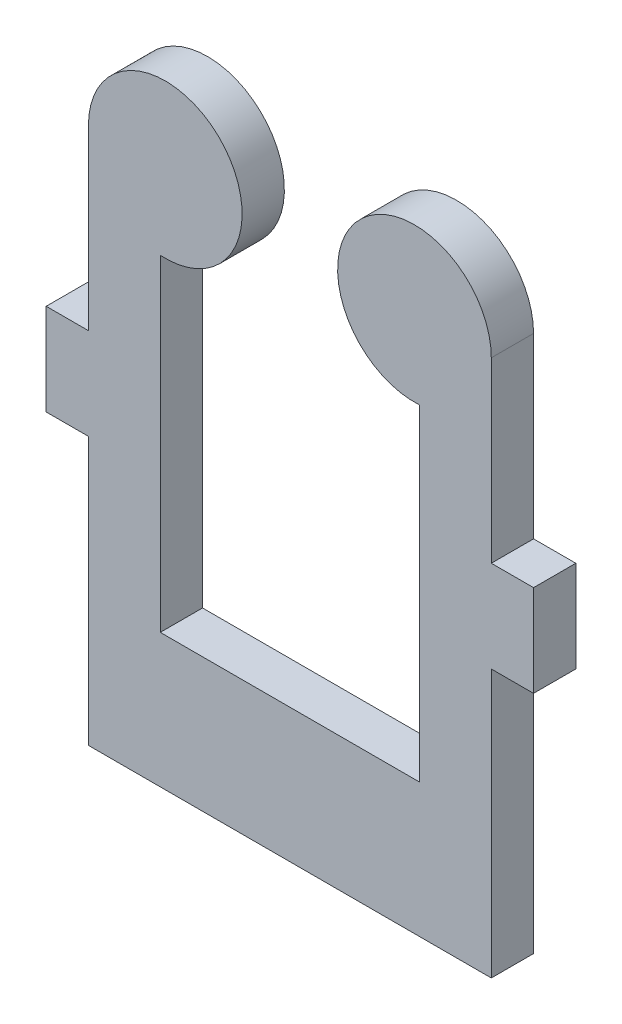
ISO-10303-21;
HEADER;
FILE_DESCRIPTION(('STEP AP214'),'2;1');
FILE_NAME('part.step','',(''),(''),'','','');
FILE_SCHEMA(('AUTOMOTIVE_DESIGN { 1 0 10303 214 1 1 1 1 }'));
ENDSEC;
DATA;
#1=APPLICATION_CONTEXT('core data for automotive mechanical design processes');
#2=APPLICATION_PROTOCOL_DEFINITION('international standard','automotive_design',2000,#1);
#3=PRODUCT_CONTEXT('',#1,'mechanical');
#4=PRODUCT('Part','Part','',(#3));
#5=PRODUCT_RELATED_PRODUCT_CATEGORY('part','',(#4));
#6=PRODUCT_DEFINITION_FORMATION('','',#4);
#7=PRODUCT_DEFINITION_CONTEXT('part definition',#1,'design');
#8=PRODUCT_DEFINITION('design','',#6,#7);
#9=PRODUCT_DEFINITION_SHAPE('','',#8);
#10=(LENGTH_UNIT() NAMED_UNIT(*) SI_UNIT(.MILLI.,.METRE.));
#11=(NAMED_UNIT(*) PLANE_ANGLE_UNIT() SI_UNIT($,.RADIAN.));
#12=(NAMED_UNIT(*) SI_UNIT($,.STERADIAN.) SOLID_ANGLE_UNIT());
#13=UNCERTAINTY_MEASURE_WITH_UNIT(LENGTH_MEASURE(1.E-05),#10,'distance_accuracy_value','');
#14=(GEOMETRIC_REPRESENTATION_CONTEXT(3) GLOBAL_UNCERTAINTY_ASSIGNED_CONTEXT((#13)) GLOBAL_UNIT_ASSIGNED_CONTEXT((#10,
#11,#12)) REPRESENTATION_CONTEXT('',''));
#15=CARTESIAN_POINT('',(0.,0.,0.));
#16=DIRECTION('',(0.,0.,1.));
#17=DIRECTION('',(1.,0.,0.));
#18=AXIS2_PLACEMENT_3D('',#15,#16,#17);
#19=CARTESIAN_POINT('',(-9.2,4.5,15.55));
#20=DIRECTION('',(-1.,0.,0.));
#21=DIRECTION('',(0.,-1.,0.));
#22=AXIS2_PLACEMENT_3D('',#19,#20,#21);
#23=PLANE('',#22);
#24=DIRECTION('',(0.,1.,0.));
#25=VECTOR('',#24,1.);
#26=CARTESIAN_POINT('',(-9.2,4.5,12.55));
#27=LINE('',#26,#25);
#28=CARTESIAN_POINT('',(-9.2,4.5,12.55));
#29=VERTEX_POINT('',#28);
#30=CARTESIAN_POINT('',(-9.20000000000001,27.686563585381,12.55));
#31=VERTEX_POINT('',#30);
#32=EDGE_CURVE('E188',#29,#31,#27,.T.);
#33=ORIENTED_EDGE('',*,*,#32,.T.);
#34=DIRECTION('',(0.,0.,-1.));
#35=VECTOR('',#34,1.);
#36=CARTESIAN_POINT('',(-9.20000000000001,27.686563585381,15.55));
#37=LINE('',#36,#35);
#38=CARTESIAN_POINT('',(-9.20000000000001,27.686563585381,15.55));
#39=VERTEX_POINT('',#38);
#40=EDGE_CURVE('E11',#39,#31,#37,.T.);
#41=ORIENTED_EDGE('',*,*,#40,.F.);
#42=DIRECTION('',(0.,1.,0.));
#43=VECTOR('',#42,1.);
#44=CARTESIAN_POINT('',(-9.2,4.5,15.55));
#45=LINE('',#44,#43);
#46=CARTESIAN_POINT('',(-9.2,4.5,15.55));
#47=VERTEX_POINT('',#46);
#48=EDGE_CURVE('E234',#47,#39,#45,.T.);
#49=ORIENTED_EDGE('',*,*,#48,.F.);
#50=DIRECTION('',(0.,0.,-1.));
#51=VECTOR('',#50,1.);
#52=CARTESIAN_POINT('',(-9.2,4.5,15.55));
#53=LINE('',#52,#51);
#54=EDGE_CURVE('E184',#47,#29,#53,.T.);
#55=ORIENTED_EDGE('',*,*,#54,.T.);
#56=EDGE_LOOP('',(#33,#41,#49,#55));
#57=FACE_BOUND('',#56,.T.);
#58=ADVANCED_FACE('F39',(#57),#23,.F.);
#59=CARTESIAN_POINT('',(-8.845,33.13,15.55));
#60=DIRECTION('',(0.,0.,-1.));
#61=DIRECTION('',(-1.,0.,0.));
#62=AXIS2_PLACEMENT_3D('',#59,#60,#61);
#63=CYLINDRICAL_SURFACE('',#62,5.455);
#64=CARTESIAN_POINT('',(-8.845,33.13,12.55));
#65=DIRECTION('',(0.,0.,1.));
#66=DIRECTION('',(1.,0.,0.));
#67=AXIS2_PLACEMENT_3D('',#64,#65,#66);
#68=CIRCLE('',#67,5.455);
#69=CARTESIAN_POINT('',(-14.3,33.13,12.55));
#70=VERTEX_POINT('',#69);
#71=EDGE_CURVE('E192',#31,#70,#68,.T.);
#72=ORIENTED_EDGE('',*,*,#71,.T.);
#73=DIRECTION('',(0.,0.,-1.));
#74=VECTOR('',#73,1.);
#75=CARTESIAN_POINT('',(-14.3,33.13,15.55));
#76=LINE('',#75,#74);
#77=CARTESIAN_POINT('',(-14.3,33.13,15.55));
#78=VERTEX_POINT('',#77);
#79=EDGE_CURVE('E48',#78,#70,#76,.T.);
#80=ORIENTED_EDGE('',*,*,#79,.F.);
#81=CARTESIAN_POINT('',(-8.845,33.13,15.55));
#82=DIRECTION('',(0.,0.,1.));
#83=DIRECTION('',(1.,0.,0.));
#84=AXIS2_PLACEMENT_3D('',#81,#82,#83);
#85=CIRCLE('',#84,5.455);
#86=EDGE_CURVE('E123',#39,#78,#85,.T.);
#87=ORIENTED_EDGE('',*,*,#86,.F.);
#88=ORIENTED_EDGE('',*,*,#40,.T.);
#89=EDGE_LOOP('',(#72,#80,#87,#88));
#90=FACE_BOUND('',#89,.T.);
#91=ADVANCED_FACE('F356',(#90),#63,.T.);
#92=CARTESIAN_POINT('',(-14.3,33.13,15.55));
#93=DIRECTION('',(1.,0.,0.));
#94=DIRECTION('',(0.,1.,0.));
#95=AXIS2_PLACEMENT_3D('',#92,#93,#94);
#96=PLANE('',#95);
#97=DIRECTION('',(0.,-1.,0.));
#98=VECTOR('',#97,1.);
#99=CARTESIAN_POINT('',(-14.3,33.13,12.55));
#100=LINE('',#99,#98);
#101=CARTESIAN_POINT('',(-14.3,20.5,12.55));
#102=VERTEX_POINT('',#101);
#103=EDGE_CURVE('E195',#70,#102,#100,.T.);
#104=ORIENTED_EDGE('',*,*,#103,.T.);
#105=DIRECTION('',(0.,0.,-1.));
#106=VECTOR('',#105,1.);
#107=CARTESIAN_POINT('',(-14.3,20.5,15.55));
#108=LINE('',#107,#106);
#109=CARTESIAN_POINT('',(-14.3,20.5,15.55));
#110=VERTEX_POINT('',#109);
#111=EDGE_CURVE('E277',#110,#102,#108,.T.);
#112=ORIENTED_EDGE('',*,*,#111,.F.);
#113=DIRECTION('',(0.,-1.,0.));
#114=VECTOR('',#113,1.);
#115=CARTESIAN_POINT('',(-14.3,33.13,15.55));
#116=LINE('',#115,#114);
#117=EDGE_CURVE('E287',#78,#110,#116,.T.);
#118=ORIENTED_EDGE('',*,*,#117,.F.);
#119=ORIENTED_EDGE('',*,*,#79,.T.);
#120=EDGE_LOOP('',(#104,#112,#118,#119));
#121=FACE_BOUND('',#120,.T.);
#122=ADVANCED_FACE('F285',(#121),#96,.F.);
#123=CARTESIAN_POINT('',(-14.3,20.5,15.55));
#124=DIRECTION('',(0.,-1.,0.));
#125=DIRECTION('',(0.,0.,-1.));
#126=AXIS2_PLACEMENT_3D('',#123,#124,#125);
#127=PLANE('',#126);
#128=DIRECTION('',(-1.,0.,0.));
#129=VECTOR('',#128,1.);
#130=CARTESIAN_POINT('',(-14.3,20.5,12.55));
#131=LINE('',#130,#129);
#132=CARTESIAN_POINT('',(-17.3,20.5,12.55));
#133=VERTEX_POINT('',#132);
#134=EDGE_CURVE('E198',#102,#133,#131,.T.);
#135=ORIENTED_EDGE('',*,*,#134,.T.);
#136=DIRECTION('',(0.,0.,-1.));
#137=VECTOR('',#136,1.);
#138=CARTESIAN_POINT('',(-17.3,20.5,15.55));
#139=LINE('',#138,#137);
#140=CARTESIAN_POINT('',(-17.3,20.5,15.55));
#141=VERTEX_POINT('',#140);
#142=EDGE_CURVE('E273',#141,#133,#139,.T.);
#143=ORIENTED_EDGE('',*,*,#142,.F.);
#144=DIRECTION('',(-1.,0.,0.));
#145=VECTOR('',#144,1.);
#146=CARTESIAN_POINT('',(-14.3,20.5,15.55));
#147=LINE('',#146,#145);
#148=EDGE_CURVE('E306',#110,#141,#147,.T.);
#149=ORIENTED_EDGE('',*,*,#148,.F.);
#150=ORIENTED_EDGE('',*,*,#111,.T.);
#151=EDGE_LOOP('',(#135,#143,#149,#150));
#152=FACE_BOUND('',#151,.T.);
#153=ADVANCED_FACE('F296',(#152),#127,.F.);
#154=CARTESIAN_POINT('',(-17.3,14.,15.55));
#155=DIRECTION('',(1.,0.,0.));
#156=DIRECTION('',(0.,1.,0.));
#157=AXIS2_PLACEMENT_3D('',#154,#155,#156);
#158=PLANE('',#157);
#159=DIRECTION('',(0.,-1.,0.));
#160=VECTOR('',#159,1.);
#161=CARTESIAN_POINT('',(-17.3,14.,12.55));
#162=LINE('',#161,#160);
#163=CARTESIAN_POINT('',(-17.3,14.,12.55));
#164=VERTEX_POINT('',#163);
#165=EDGE_CURVE('E201',#133,#164,#162,.T.);
#166=ORIENTED_EDGE('',*,*,#165,.T.);
#167=DIRECTION('',(0.,0.,-1.));
#168=VECTOR('',#167,1.);
#169=CARTESIAN_POINT('',(-17.3,14.,15.55));
#170=LINE('',#169,#168);
#171=CARTESIAN_POINT('',(-17.3,14.,15.55));
#172=VERTEX_POINT('',#171);
#173=EDGE_CURVE('E269',#172,#164,#170,.T.);
#174=ORIENTED_EDGE('',*,*,#173,.F.);
#175=DIRECTION('',(0.,-1.,0.));
#176=VECTOR('',#175,1.);
#177=CARTESIAN_POINT('',(-17.3,14.,15.55));
#178=LINE('',#177,#176);
#179=EDGE_CURVE('E302',#141,#172,#178,.T.);
#180=ORIENTED_EDGE('',*,*,#179,.F.);
#181=ORIENTED_EDGE('',*,*,#142,.T.);
#182=EDGE_LOOP('',(#166,#174,#180,#181));
#183=FACE_BOUND('',#182,.T.);
#184=ADVANCED_FACE('F300',(#183),#158,.F.);
#185=CARTESIAN_POINT('',(-14.3,14.,15.55));
#186=DIRECTION('',(0.,1.,0.));
#187=DIRECTION('',(0.,0.,1.));
#188=AXIS2_PLACEMENT_3D('',#185,#186,#187);
#189=PLANE('',#188);
#190=DIRECTION('',(1.,0.,0.));
#191=VECTOR('',#190,1.);
#192=CARTESIAN_POINT('',(-14.3,14.,12.55));
#193=LINE('',#192,#191);
#194=CARTESIAN_POINT('',(-14.3,14.,12.55));
#195=VERTEX_POINT('',#194);
#196=EDGE_CURVE('E204',#164,#195,#193,.T.);
#197=ORIENTED_EDGE('',*,*,#196,.T.);
#198=DIRECTION('',(0.,0.,-1.));
#199=VECTOR('',#198,1.);
#200=CARTESIAN_POINT('',(-14.3,14.,15.55));
#201=LINE('',#200,#199);
#202=CARTESIAN_POINT('',(-14.3,14.,15.55));
#203=VERTEX_POINT('',#202);
#204=EDGE_CURVE('E265',#203,#195,#201,.T.);
#205=ORIENTED_EDGE('',*,*,#204,.F.);
#206=DIRECTION('',(1.,0.,0.));
#207=VECTOR('',#206,1.);
#208=CARTESIAN_POINT('',(-14.3,14.,15.55));
#209=LINE('',#208,#207);
#210=EDGE_CURVE('E305',#172,#203,#209,.T.);
#211=ORIENTED_EDGE('',*,*,#210,.F.);
#212=ORIENTED_EDGE('',*,*,#173,.T.);
#213=EDGE_LOOP('',(#197,#205,#211,#212));
#214=FACE_BOUND('',#213,.T.);
#215=ADVANCED_FACE('F369',(#214),#189,.F.);
#216=CARTESIAN_POINT('',(-14.3,14.,15.55));
#217=DIRECTION('',(1.,0.,0.));
#218=DIRECTION('',(0.,1.,0.));
#219=AXIS2_PLACEMENT_3D('',#216,#217,#218);
#220=PLANE('',#219);
#221=DIRECTION('',(0.,-1.,0.));
#222=VECTOR('',#221,1.);
#223=CARTESIAN_POINT('',(-14.3,14.,12.55));
#224=LINE('',#223,#222);
#225=CARTESIAN_POINT('',(-14.3,-5.,12.55));
#226=VERTEX_POINT('',#225);
#227=EDGE_CURVE('E207',#195,#226,#224,.T.);
#228=ORIENTED_EDGE('',*,*,#227,.T.);
#229=DIRECTION('',(0.,0.,-1.));
#230=VECTOR('',#229,1.);
#231=CARTESIAN_POINT('',(-14.3,-5.,15.55));
#232=LINE('',#231,#230);
#233=CARTESIAN_POINT('',(-14.3,-5.,15.55));
#234=VERTEX_POINT('',#233);
#235=EDGE_CURVE('E261',#234,#226,#232,.T.);
#236=ORIENTED_EDGE('',*,*,#235,.F.);
#237=DIRECTION('',(0.,-1.,0.));
#238=VECTOR('',#237,1.);
#239=CARTESIAN_POINT('',(-14.3,14.,15.55));
#240=LINE('',#239,#238);
#241=EDGE_CURVE('E310',#203,#234,#240,.T.);
#242=ORIENTED_EDGE('',*,*,#241,.F.);
#243=ORIENTED_EDGE('',*,*,#204,.T.);
#244=EDGE_LOOP('',(#228,#236,#242,#243));
#245=FACE_BOUND('',#244,.T.);
#246=ADVANCED_FACE('F372',(#245),#220,.F.);
#247=CARTESIAN_POINT('',(-14.3,-5.,15.55));
#248=DIRECTION('',(0.,1.,0.));
#249=DIRECTION('',(-1.,0.,0.));
#250=AXIS2_PLACEMENT_3D('',#247,#248,#249);
#251=PLANE('',#250);
#252=DIRECTION('',(1.,0.,0.));
#253=VECTOR('',#252,1.);
#254=CARTESIAN_POINT('',(-14.3,-5.,12.55));
#255=LINE('',#254,#253);
#256=CARTESIAN_POINT('',(14.3,-4.99999999999999,12.55));
#257=VERTEX_POINT('',#256);
#258=EDGE_CURVE('E210',#226,#257,#255,.T.);
#259=ORIENTED_EDGE('',*,*,#258,.T.);
#260=DIRECTION('',(0.,0.,-1.));
#261=VECTOR('',#260,1.);
#262=CARTESIAN_POINT('',(14.3,-4.99999999999999,15.55));
#263=LINE('',#262,#261);
#264=CARTESIAN_POINT('',(14.3,-4.99999999999999,15.55));
#265=VERTEX_POINT('',#264);
#266=EDGE_CURVE('E257',#265,#257,#263,.T.);
#267=ORIENTED_EDGE('',*,*,#266,.F.);
#268=DIRECTION('',(1.,0.,0.));
#269=VECTOR('',#268,1.);
#270=CARTESIAN_POINT('',(-14.3,-5.,15.55));
#271=LINE('',#270,#269);
#272=EDGE_CURVE('E317',#234,#265,#271,.T.);
#273=ORIENTED_EDGE('',*,*,#272,.F.);
#274=ORIENTED_EDGE('',*,*,#235,.T.);
#275=EDGE_LOOP('',(#259,#267,#273,#274));
#276=FACE_BOUND('',#275,.T.);
#277=ADVANCED_FACE('F376',(#276),#251,.F.);
#278=CARTESIAN_POINT('',(14.3,14.,15.55));
#279=DIRECTION('',(-1.,0.,0.));
#280=DIRECTION('',(0.,-1.,0.));
#281=AXIS2_PLACEMENT_3D('',#278,#279,#280);
#282=PLANE('',#281);
#283=DIRECTION('',(0.,1.,0.));
#284=VECTOR('',#283,1.);
#285=CARTESIAN_POINT('',(14.3,14.,12.55));
#286=LINE('',#285,#284);
#287=CARTESIAN_POINT('',(14.3,14.,12.55));
#288=VERTEX_POINT('',#287);
#289=EDGE_CURVE('E213',#257,#288,#286,.T.);
#290=ORIENTED_EDGE('',*,*,#289,.T.);
#291=DIRECTION('',(0.,0.,-1.));
#292=VECTOR('',#291,1.);
#293=CARTESIAN_POINT('',(14.3,14.,15.55));
#294=LINE('',#293,#292);
#295=CARTESIAN_POINT('',(14.3,14.,15.55));
#296=VERTEX_POINT('',#295);
#297=EDGE_CURVE('E253',#296,#288,#294,.T.);
#298=ORIENTED_EDGE('',*,*,#297,.F.);
#299=DIRECTION('',(0.,1.,0.));
#300=VECTOR('',#299,1.);
#301=CARTESIAN_POINT('',(14.3,14.,15.55));
#302=LINE('',#301,#300);
#303=EDGE_CURVE('E320',#265,#296,#302,.T.);
#304=ORIENTED_EDGE('',*,*,#303,.F.);
#305=ORIENTED_EDGE('',*,*,#266,.T.);
#306=EDGE_LOOP('',(#290,#298,#304,#305));
#307=FACE_BOUND('',#306,.T.);
#308=ADVANCED_FACE('F380',(#307),#282,.F.);
#309=CARTESIAN_POINT('',(14.3,14.,15.55));
#310=DIRECTION('',(0.,1.,0.));
#311=DIRECTION('',(0.,0.,1.));
#312=AXIS2_PLACEMENT_3D('',#309,#310,#311);
#313=PLANE('',#312);
#314=DIRECTION('',(1.,0.,0.));
#315=VECTOR('',#314,1.);
#316=CARTESIAN_POINT('',(14.3,14.,12.55));
#317=LINE('',#316,#315);
#318=CARTESIAN_POINT('',(17.3,14.,12.55));
#319=VERTEX_POINT('',#318);
#320=EDGE_CURVE('E216',#288,#319,#317,.T.);
#321=ORIENTED_EDGE('',*,*,#320,.T.);
#322=DIRECTION('',(0.,0.,-1.));
#323=VECTOR('',#322,1.);
#324=CARTESIAN_POINT('',(17.3,14.,15.55));
#325=LINE('',#324,#323);
#326=CARTESIAN_POINT('',(17.3,14.,15.55));
#327=VERTEX_POINT('',#326);
#328=EDGE_CURVE('E249',#327,#319,#325,.T.);
#329=ORIENTED_EDGE('',*,*,#328,.F.);
#330=DIRECTION('',(1.,0.,0.));
#331=VECTOR('',#330,1.);
#332=CARTESIAN_POINT('',(14.3,14.,15.55));
#333=LINE('',#332,#331);
#334=EDGE_CURVE('E323',#296,#327,#333,.T.);
#335=ORIENTED_EDGE('',*,*,#334,.F.);
#336=ORIENTED_EDGE('',*,*,#297,.T.);
#337=EDGE_LOOP('',(#321,#329,#335,#336));
#338=FACE_BOUND('',#337,.T.);
#339=ADVANCED_FACE('F384',(#338),#313,.F.);
#340=CARTESIAN_POINT('',(17.3,14.,15.55));
#341=DIRECTION('',(-1.,0.,0.));
#342=DIRECTION('',(0.,-1.,0.));
#343=AXIS2_PLACEMENT_3D('',#340,#341,#342);
#344=PLANE('',#343);
#345=DIRECTION('',(0.,1.,0.));
#346=VECTOR('',#345,1.);
#347=CARTESIAN_POINT('',(17.3,14.,12.55));
#348=LINE('',#347,#346);
#349=CARTESIAN_POINT('',(17.3,20.5,12.55));
#350=VERTEX_POINT('',#349);
#351=EDGE_CURVE('E219',#319,#350,#348,.T.);
#352=ORIENTED_EDGE('',*,*,#351,.T.);
#353=DIRECTION('',(0.,0.,-1.));
#354=VECTOR('',#353,1.);
#355=CARTESIAN_POINT('',(17.3,20.5,15.55));
#356=LINE('',#355,#354);
#357=CARTESIAN_POINT('',(17.3,20.5,15.55));
#358=VERTEX_POINT('',#357);
#359=EDGE_CURVE('E245',#358,#350,#356,.T.);
#360=ORIENTED_EDGE('',*,*,#359,.F.);
#361=DIRECTION('',(0.,1.,0.));
#362=VECTOR('',#361,1.);
#363=CARTESIAN_POINT('',(17.3,14.,15.55));
#364=LINE('',#363,#362);
#365=EDGE_CURVE('E326',#327,#358,#364,.T.);
#366=ORIENTED_EDGE('',*,*,#365,.F.);
#367=ORIENTED_EDGE('',*,*,#328,.T.);
#368=EDGE_LOOP('',(#352,#360,#366,#367));
#369=FACE_BOUND('',#368,.T.);
#370=ADVANCED_FACE('F388',(#369),#344,.F.);
#371=CARTESIAN_POINT('',(14.3,20.5,15.55));
#372=DIRECTION('',(0.,-1.,0.));
#373=DIRECTION('',(0.,0.,-1.));
#374=AXIS2_PLACEMENT_3D('',#371,#372,#373);
#375=PLANE('',#374);
#376=DIRECTION('',(-1.,0.,0.));
#377=VECTOR('',#376,1.);
#378=CARTESIAN_POINT('',(14.3,20.5,12.55));
#379=LINE('',#378,#377);
#380=CARTESIAN_POINT('',(14.3,20.5,12.55));
#381=VERTEX_POINT('',#380);
#382=EDGE_CURVE('E222',#350,#381,#379,.T.);
#383=ORIENTED_EDGE('',*,*,#382,.T.);
#384=DIRECTION('',(0.,0.,-1.));
#385=VECTOR('',#384,1.);
#386=CARTESIAN_POINT('',(14.3,20.5,15.55));
#387=LINE('',#386,#385);
#388=CARTESIAN_POINT('',(14.3,20.5,15.55));
#389=VERTEX_POINT('',#388);
#390=EDGE_CURVE('E241',#389,#381,#387,.T.);
#391=ORIENTED_EDGE('',*,*,#390,.F.);
#392=DIRECTION('',(-1.,0.,0.));
#393=VECTOR('',#392,1.);
#394=CARTESIAN_POINT('',(14.3,20.5,15.55));
#395=LINE('',#394,#393);
#396=EDGE_CURVE('E329',#358,#389,#395,.T.);
#397=ORIENTED_EDGE('',*,*,#396,.F.);
#398=ORIENTED_EDGE('',*,*,#359,.T.);
#399=EDGE_LOOP('',(#383,#391,#397,#398));
#400=FACE_BOUND('',#399,.T.);
#401=ADVANCED_FACE('F337',(#400),#375,.F.);
#402=CARTESIAN_POINT('',(14.3,33.13,15.55));
#403=DIRECTION('',(-1.,0.,0.));
#404=DIRECTION('',(0.,-1.,0.));
#405=AXIS2_PLACEMENT_3D('',#402,#403,#404);
#406=PLANE('',#405);
#407=DIRECTION('',(0.,1.,0.));
#408=VECTOR('',#407,1.);
#409=CARTESIAN_POINT('',(14.3,33.13,12.55));
#410=LINE('',#409,#408);
#411=CARTESIAN_POINT('',(14.3,33.13,12.55));
#412=VERTEX_POINT('',#411);
#413=EDGE_CURVE('E225',#381,#412,#410,.T.);
#414=ORIENTED_EDGE('',*,*,#413,.T.);
#415=DIRECTION('',(0.,0.,-1.));
#416=VECTOR('',#415,1.);
#417=CARTESIAN_POINT('',(14.3,33.13,15.55));
#418=LINE('',#417,#416);
#419=CARTESIAN_POINT('',(14.3,33.13,15.55));
#420=VERTEX_POINT('',#419);
#421=EDGE_CURVE('E177',#420,#412,#418,.T.);
#422=ORIENTED_EDGE('',*,*,#421,.F.);
#423=DIRECTION('',(0.,1.,0.));
#424=VECTOR('',#423,1.);
#425=CARTESIAN_POINT('',(14.3,33.13,15.55));
#426=LINE('',#425,#424);
#427=EDGE_CURVE('E166',#389,#420,#426,.T.);
#428=ORIENTED_EDGE('',*,*,#427,.F.);
#429=ORIENTED_EDGE('',*,*,#390,.T.);
#430=EDGE_LOOP('',(#414,#422,#428,#429));
#431=FACE_BOUND('',#430,.T.);
#432=ADVANCED_FACE('F341',(#431),#406,.F.);
#433=CARTESIAN_POINT('',(8.84499999999999,33.13,15.55));
#434=DIRECTION('',(0.,0.,-1.));
#435=DIRECTION('',(-1.,0.,0.));
#436=AXIS2_PLACEMENT_3D('',#433,#434,#435);
#437=CYLINDRICAL_SURFACE('',#436,5.455);
#438=CARTESIAN_POINT('',(8.84499999999999,33.13,12.55));
#439=DIRECTION('',(0.,0.,1.));
#440=DIRECTION('',(-1.,0.,0.));
#441=AXIS2_PLACEMENT_3D('',#438,#439,#440);
#442=CIRCLE('',#441,5.455);
#443=CARTESIAN_POINT('',(9.2,27.686563585381,12.55));
#444=VERTEX_POINT('',#443);
#445=EDGE_CURVE('E175',#412,#444,#442,.T.);
#446=ORIENTED_EDGE('',*,*,#445,.T.);
#447=DIRECTION('',(0.,0.,-1.));
#448=VECTOR('',#447,1.);
#449=CARTESIAN_POINT('',(9.2,27.686563585381,15.55));
#450=LINE('',#449,#448);
#451=CARTESIAN_POINT('',(9.2,27.686563585381,15.55));
#452=VERTEX_POINT('',#451);
#453=EDGE_CURVE('E172',#452,#444,#450,.T.);
#454=ORIENTED_EDGE('',*,*,#453,.F.);
#455=CARTESIAN_POINT('',(8.84499999999999,33.13,15.55));
#456=DIRECTION('',(0.,0.,1.));
#457=DIRECTION('',(-1.,0.,0.));
#458=AXIS2_PLACEMENT_3D('',#455,#456,#457);
#459=CIRCLE('',#458,5.455);
#460=EDGE_CURVE('E160',#420,#452,#459,.T.);
#461=ORIENTED_EDGE('',*,*,#460,.F.);
#462=ORIENTED_EDGE('',*,*,#421,.T.);
#463=EDGE_LOOP('',(#446,#454,#461,#462));
#464=FACE_BOUND('',#463,.T.);
#465=ADVANCED_FACE('F173',(#464),#437,.T.);
#466=CARTESIAN_POINT('',(9.2,4.50000000000001,15.55));
#467=DIRECTION('',(1.,0.,0.));
#468=DIRECTION('',(0.,1.,0.));
#469=AXIS2_PLACEMENT_3D('',#466,#467,#468);
#470=PLANE('',#469);
#471=DIRECTION('',(0.,-1.,0.));
#472=VECTOR('',#471,1.);
#473=CARTESIAN_POINT('',(9.2,4.50000000000001,12.55));
#474=LINE('',#473,#472);
#475=CARTESIAN_POINT('',(9.2,4.50000000000001,12.55));
#476=VERTEX_POINT('',#475);
#477=EDGE_CURVE('E109',#444,#476,#474,.T.);
#478=ORIENTED_EDGE('',*,*,#477,.T.);
#479=DIRECTION('',(0.,0.,-1.));
#480=VECTOR('',#479,1.);
#481=CARTESIAN_POINT('',(9.2,4.50000000000001,15.55));
#482=LINE('',#481,#480);
#483=CARTESIAN_POINT('',(9.2,4.50000000000001,15.55));
#484=VERTEX_POINT('',#483);
#485=EDGE_CURVE('E178',#484,#476,#482,.T.);
#486=ORIENTED_EDGE('',*,*,#485,.F.);
#487=DIRECTION('',(0.,-1.,0.));
#488=VECTOR('',#487,1.);
#489=CARTESIAN_POINT('',(9.2,4.50000000000001,15.55));
#490=LINE('',#489,#488);
#491=EDGE_CURVE('E164',#452,#484,#490,.T.);
#492=ORIENTED_EDGE('',*,*,#491,.F.);
#493=ORIENTED_EDGE('',*,*,#453,.T.);
#494=EDGE_LOOP('',(#478,#486,#492,#493));
#495=FACE_BOUND('',#494,.T.);
#496=ADVANCED_FACE('F180',(#495),#470,.F.);
#497=CARTESIAN_POINT('',(9.2,4.50000000000001,15.55));
#498=DIRECTION('',(0.,-1.,0.));
#499=DIRECTION('',(1.,0.,0.));
#500=AXIS2_PLACEMENT_3D('',#497,#498,#499);
#501=PLANE('',#500);
#502=DIRECTION('',(-1.,0.,0.));
#503=VECTOR('',#502,1.);
#504=CARTESIAN_POINT('',(9.2,4.50000000000001,12.55));
#505=LINE('',#504,#503);
#506=EDGE_CURVE('E115',#476,#29,#505,.T.);
#507=ORIENTED_EDGE('',*,*,#506,.T.);
#508=ORIENTED_EDGE('',*,*,#54,.F.);
#509=DIRECTION('',(-1.,0.,0.));
#510=VECTOR('',#509,1.);
#511=CARTESIAN_POINT('',(9.2,4.50000000000001,15.55));
#512=LINE('',#511,#510);
#513=EDGE_CURVE('E56',#484,#47,#512,.T.);
#514=ORIENTED_EDGE('',*,*,#513,.F.);
#515=ORIENTED_EDGE('',*,*,#485,.T.);
#516=EDGE_LOOP('',(#507,#508,#514,#515));
#517=FACE_BOUND('',#516,.T.);
#518=ADVANCED_FACE('F345',(#517),#501,.F.);
#519=CARTESIAN_POINT('',(-8.845,33.13,15.55));
#520=DIRECTION('',(0.,0.,1.));
#521=DIRECTION('',(1.,0.,0.));
#522=AXIS2_PLACEMENT_3D('',#519,#520,#521);
#523=PLANE('',#522);
#524=ORIENTED_EDGE('',*,*,#48,.T.);
#525=ORIENTED_EDGE('',*,*,#86,.T.);
#526=ORIENTED_EDGE('',*,*,#117,.T.);
#527=ORIENTED_EDGE('',*,*,#148,.T.);
#528=ORIENTED_EDGE('',*,*,#179,.T.);
#529=ORIENTED_EDGE('',*,*,#210,.T.);
#530=ORIENTED_EDGE('',*,*,#241,.T.);
#531=ORIENTED_EDGE('',*,*,#272,.T.);
#532=ORIENTED_EDGE('',*,*,#303,.T.);
#533=ORIENTED_EDGE('',*,*,#334,.T.);
#534=ORIENTED_EDGE('',*,*,#365,.T.);
#535=ORIENTED_EDGE('',*,*,#396,.T.);
#536=ORIENTED_EDGE('',*,*,#427,.T.);
#537=ORIENTED_EDGE('',*,*,#460,.T.);
#538=ORIENTED_EDGE('',*,*,#491,.T.);
#539=ORIENTED_EDGE('',*,*,#513,.T.);
#540=EDGE_LOOP('',(#524,#525,#526,#527,#528,#529,#530,#531,#532,#533,#534,#535,#536,#537,#538,#539));
#541=FACE_BOUND('',#540,.T.);
#542=ADVANCED_FACE('F162',(#541),#523,.T.);
#543=CARTESIAN_POINT('',(-8.845,33.13,12.55));
#544=DIRECTION('',(0.,0.,1.));
#545=DIRECTION('',(1.,0.,0.));
#546=AXIS2_PLACEMENT_3D('',#543,#544,#545);
#547=PLANE('',#546);
#548=ORIENTED_EDGE('',*,*,#32,.F.);
#549=ORIENTED_EDGE('',*,*,#506,.F.);
#550=ORIENTED_EDGE('',*,*,#477,.F.);
#551=ORIENTED_EDGE('',*,*,#445,.F.);
#552=ORIENTED_EDGE('',*,*,#413,.F.);
#553=ORIENTED_EDGE('',*,*,#382,.F.);
#554=ORIENTED_EDGE('',*,*,#351,.F.);
#555=ORIENTED_EDGE('',*,*,#320,.F.);
#556=ORIENTED_EDGE('',*,*,#289,.F.);
#557=ORIENTED_EDGE('',*,*,#258,.F.);
#558=ORIENTED_EDGE('',*,*,#227,.F.);
#559=ORIENTED_EDGE('',*,*,#196,.F.);
#560=ORIENTED_EDGE('',*,*,#165,.F.);
#561=ORIENTED_EDGE('',*,*,#134,.F.);
#562=ORIENTED_EDGE('',*,*,#103,.F.);
#563=ORIENTED_EDGE('',*,*,#71,.F.);
#564=EDGE_LOOP('',(#548,#549,#550,#551,#552,#553,#554,#555,#556,#557,#558,#559,#560,#561,#562,#563));
#565=FACE_BOUND('',#564,.T.);
#566=ADVANCED_FACE('F291',(#565),#547,.F.);
#567=CLOSED_SHELL('',(#58,#91,#122,#153,#184,#215,#246,#277,#308,#339,#370,#401,#432,#465,#496,
#518,#542,#566));
#568=MANIFOLD_SOLID_BREP('B2',#567);
#569=ADVANCED_BREP_SHAPE_REPRESENTATION('',(#18,#568),#14);
#570=SHAPE_DEFINITION_REPRESENTATION(#9,#569);
ENDSEC;
END-ISO-10303-21;
